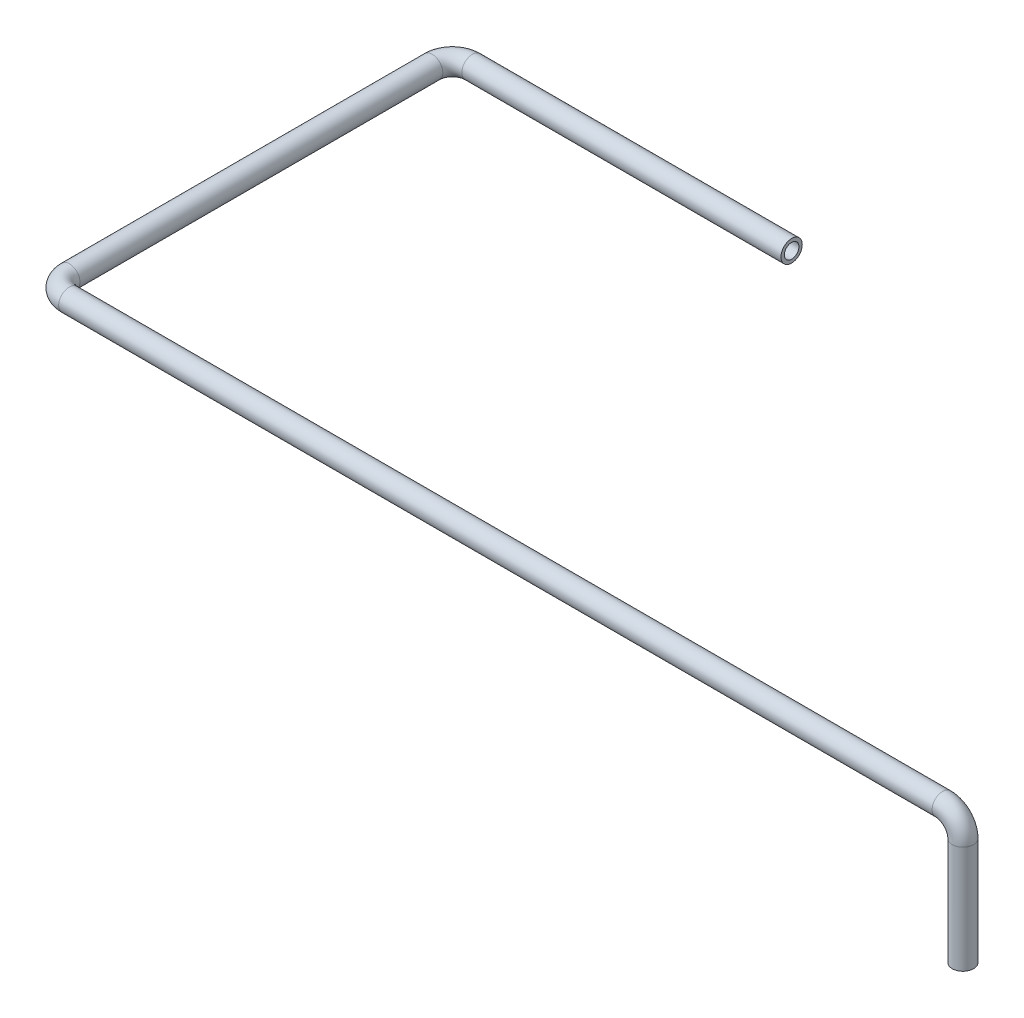
ISO-10303-21;
HEADER;
FILE_DESCRIPTION(('STEP AP214'),'2;1');
FILE_NAME('part.step','',(''),(''),'','','');
FILE_SCHEMA(('AUTOMOTIVE_DESIGN { 1 0 10303 214 1 1 1 1 }'));
ENDSEC;
DATA;
#1=APPLICATION_CONTEXT('core data for automotive mechanical design processes');
#2=APPLICATION_PROTOCOL_DEFINITION('international standard','automotive_design',2000,#1);
#3=PRODUCT_CONTEXT('',#1,'mechanical');
#4=PRODUCT('Part','Part','',(#3));
#5=PRODUCT_RELATED_PRODUCT_CATEGORY('part','',(#4));
#6=PRODUCT_DEFINITION_FORMATION('','',#4);
#7=PRODUCT_DEFINITION_CONTEXT('part definition',#1,'design');
#8=PRODUCT_DEFINITION('design','',#6,#7);
#9=PRODUCT_DEFINITION_SHAPE('','',#8);
#10=(LENGTH_UNIT() NAMED_UNIT(*) SI_UNIT(.MILLI.,.METRE.));
#11=(NAMED_UNIT(*) PLANE_ANGLE_UNIT() SI_UNIT($,.RADIAN.));
#12=(NAMED_UNIT(*) SI_UNIT($,.STERADIAN.) SOLID_ANGLE_UNIT());
#13=UNCERTAINTY_MEASURE_WITH_UNIT(LENGTH_MEASURE(1.E-05),#10,'distance_accuracy_value','');
#14=(GEOMETRIC_REPRESENTATION_CONTEXT(3) GLOBAL_UNCERTAINTY_ASSIGNED_CONTEXT((#13)) GLOBAL_UNIT_ASSIGNED_CONTEXT((#10,
#11,#12)) REPRESENTATION_CONTEXT('',''));
#15=CARTESIAN_POINT('',(0.,0.,0.));
#16=DIRECTION('',(0.,0.,1.));
#17=DIRECTION('',(1.,0.,0.));
#18=AXIS2_PLACEMENT_3D('',#15,#16,#17);
#19=CARTESIAN_POINT('',(11.,381.,67.5));
#20=DIRECTION('',(1.,0.,0.));
#21=DIRECTION('',(0.,0.,-1.));
#22=AXIS2_PLACEMENT_3D('',#19,#20,#21);
#23=PLANE('',#22);
#24=CARTESIAN_POINT('',(11.,381.,67.5));
#25=DIRECTION('',(1.,0.,0.));
#26=DIRECTION('',(0.,0.,-1.));
#27=AXIS2_PLACEMENT_3D('',#24,#25,#26);
#28=CIRCLE('',#27,2.17500000000001);
#29=CARTESIAN_POINT('',(11.,381.,65.325));
#30=VERTEX_POINT('',#29);
#31=EDGE_CURVE('E263',#30,#30,#28,.T.);
#32=ORIENTED_EDGE('',*,*,#31,.F.);
#33=EDGE_LOOP('',(#32));
#34=FACE_BOUND('',#33,.T.);
#35=CARTESIAN_POINT('',(11.,381.,67.5));
#36=DIRECTION('',(1.,0.,0.));
#37=DIRECTION('',(0.,0.,-1.));
#38=AXIS2_PLACEMENT_3D('',#35,#36,#37);
#39=CIRCLE('',#38,3.17500000000001);
#40=CARTESIAN_POINT('',(11.,381.,64.325));
#41=VERTEX_POINT('',#40);
#42=EDGE_CURVE('E75',#41,#41,#39,.T.);
#43=ORIENTED_EDGE('',*,*,#42,.T.);
#44=EDGE_LOOP('',(#43));
#45=FACE_BOUND('',#44,.T.);
#46=ADVANCED_FACE('F52',(#34,#45),#23,.T.);
#47=CARTESIAN_POINT('',(182.,343.,187.5));
#48=DIRECTION('',(0.,1.,0.));
#49=DIRECTION('',(0.,0.,1.));
#50=AXIS2_PLACEMENT_3D('',#47,#48,#49);
#51=PLANE('',#50);
#52=CARTESIAN_POINT('',(182.,343.,187.5));
#53=DIRECTION('',(0.,1.,0.));
#54=DIRECTION('',(0.,0.,1.));
#55=AXIS2_PLACEMENT_3D('',#52,#53,#54);
#56=CIRCLE('',#55,2.17500000000001);
#57=CARTESIAN_POINT('',(182.,343.,189.675));
#58=VERTEX_POINT('',#57);
#59=EDGE_CURVE('E73',#58,#58,#56,.T.);
#60=ORIENTED_EDGE('',*,*,#59,.T.);
#61=EDGE_LOOP('',(#60));
#62=FACE_BOUND('',#61,.T.);
#63=CARTESIAN_POINT('',(182.,343.,187.5));
#64=DIRECTION('',(0.,1.,0.));
#65=DIRECTION('',(0.,0.,1.));
#66=AXIS2_PLACEMENT_3D('',#63,#64,#65);
#67=CIRCLE('',#66,3.17500000000001);
#68=CARTESIAN_POINT('',(182.,343.,190.675));
#69=VERTEX_POINT('',#68);
#70=EDGE_CURVE('E11',#69,#69,#67,.T.);
#71=ORIENTED_EDGE('',*,*,#70,.F.);
#72=EDGE_LOOP('',(#71));
#73=FACE_BOUND('',#72,.T.);
#74=ADVANCED_FACE('F149',(#62,#73),#51,.F.);
#75=CARTESIAN_POINT('',(11.,381.,67.5));
#76=DIRECTION('',(-1.,0.,0.));
#77=DIRECTION('',(0.,0.,1.));
#78=AXIS2_PLACEMENT_3D('',#75,#76,#77);
#79=CYLINDRICAL_SURFACE('',#78,3.17500000000001);
#80=CARTESIAN_POINT('',(-84.,381.,67.5));
#81=DIRECTION('',(-1.,0.,0.));
#82=DIRECTION('',(0.,0.,1.));
#83=AXIS2_PLACEMENT_3D('',#80,#81,#82);
#84=CIRCLE('',#83,3.17500000000001);
#85=CARTESIAN_POINT('',(-83.9999999999999,381.,64.325));
#86=VERTEX_POINT('',#85);
#87=EDGE_CURVE('E74',#86,#86,#84,.F.);
#88=ORIENTED_EDGE('',*,*,#87,.T.);
#89=EDGE_LOOP('',(#88));
#90=FACE_BOUND('',#89,.T.);
#91=ORIENTED_EDGE('',*,*,#42,.F.);
#92=EDGE_LOOP('',(#91));
#93=FACE_BOUND('',#92,.T.);
#94=ADVANCED_FACE('F155',(#90,#93),#79,.T.);
#95=CARTESIAN_POINT('',(-84.,381.,73.5));
#96=DIRECTION('',(0.,1.,0.));
#97=DIRECTION('',(0.,0.,1.));
#98=AXIS2_PLACEMENT_3D('',#95,#96,#97);
#99=TOROIDAL_SURFACE('',#98,6.00000000000001,3.17500000000001);
#100=CARTESIAN_POINT('',(-90.,381.,73.5));
#101=DIRECTION('',(0.,0.,-1.));
#102=DIRECTION('',(-1.,0.,0.));
#103=AXIS2_PLACEMENT_3D('',#100,#101,#102);
#104=CIRCLE('',#103,3.17500000000001);
#105=CARTESIAN_POINT('',(-93.175,381.,73.5));
#106=VERTEX_POINT('',#105);
#107=EDGE_CURVE('E78',#106,#106,#104,.T.);
#108=CARTESIAN_POINT('',(-84.,381.,73.5));
#109=DIRECTION('',(0.,1.,0.));
#110=DIRECTION('',(0.,0.,1.));
#111=AXIS2_PLACEMENT_3D('',#108,#109,#110);
#112=CIRCLE('',#111,9.17500000000002);
#113=EDGE_CURVE('',#86,#106,#112,.T.);
#114=ORIENTED_EDGE('',*,*,#87,.F.);
#115=ORIENTED_EDGE('',*,*,#107,.T.);
#116=ORIENTED_EDGE('',*,*,#113,.T.);
#117=ORIENTED_EDGE('',*,*,#113,.F.);
#118=EDGE_LOOP('',(#114,#116,#115,#117));
#119=FACE_BOUND('',#118,.T.);
#120=ADVANCED_FACE('F158',(#119),#99,.T.);
#121=CARTESIAN_POINT('',(-90.,381.,73.5));
#122=DIRECTION('',(0.,0.,1.));
#123=DIRECTION('',(1.,0.,0.));
#124=AXIS2_PLACEMENT_3D('',#121,#122,#123);
#125=CYLINDRICAL_SURFACE('',#124,3.17500000000001);
#126=CARTESIAN_POINT('',(-90.,381.,181.5));
#127=DIRECTION('',(0.,0.,1.));
#128=DIRECTION('',(1.,0.,0.));
#129=AXIS2_PLACEMENT_3D('',#126,#127,#128);
#130=CIRCLE('',#129,3.17500000000001);
#131=CARTESIAN_POINT('',(-93.175,381.,181.5));
#132=VERTEX_POINT('',#131);
#133=EDGE_CURVE('E91',#132,#132,#130,.F.);
#134=ORIENTED_EDGE('',*,*,#133,.T.);
#135=EDGE_LOOP('',(#134));
#136=FACE_BOUND('',#135,.T.);
#137=ORIENTED_EDGE('',*,*,#107,.F.);
#138=EDGE_LOOP('',(#137));
#139=FACE_BOUND('',#138,.T.);
#140=ADVANCED_FACE('F109',(#136,#139),#125,.T.);
#141=CARTESIAN_POINT('',(-84.,381.,181.5));
#142=DIRECTION('',(0.,1.,0.));
#143=DIRECTION('',(0.,0.,1.));
#144=AXIS2_PLACEMENT_3D('',#141,#142,#143);
#145=TOROIDAL_SURFACE('',#144,6.00000000000001,3.17500000000001);
#146=CARTESIAN_POINT('',(-84.,381.,187.5));
#147=DIRECTION('',(-1.,0.,0.));
#148=DIRECTION('',(0.,0.,1.));
#149=AXIS2_PLACEMENT_3D('',#146,#147,#148);
#150=CIRCLE('',#149,3.17500000000001);
#151=CARTESIAN_POINT('',(-84.0000000000001,381.,190.675));
#152=VERTEX_POINT('',#151);
#153=EDGE_CURVE('E68',#152,#152,#150,.T.);
#154=CARTESIAN_POINT('',(-84.,381.,181.5));
#155=DIRECTION('',(0.,1.,0.));
#156=DIRECTION('',(0.,0.,1.));
#157=AXIS2_PLACEMENT_3D('',#154,#155,#156);
#158=CIRCLE('',#157,9.17500000000002);
#159=EDGE_CURVE('',#132,#152,#158,.T.);
#160=ORIENTED_EDGE('',*,*,#133,.F.);
#161=ORIENTED_EDGE('',*,*,#153,.T.);
#162=ORIENTED_EDGE('',*,*,#159,.T.);
#163=ORIENTED_EDGE('',*,*,#159,.F.);
#164=EDGE_LOOP('',(#160,#162,#161,#163));
#165=FACE_BOUND('',#164,.T.);
#166=ADVANCED_FACE('F98',(#165),#145,.T.);
#167=CARTESIAN_POINT('',(-84.,381.,187.5));
#168=DIRECTION('',(1.,0.,0.));
#169=DIRECTION('',(0.,0.,-1.));
#170=AXIS2_PLACEMENT_3D('',#167,#168,#169);
#171=CYLINDRICAL_SURFACE('',#170,3.17500000000001);
#172=CARTESIAN_POINT('',(176.,381.,187.5));
#173=DIRECTION('',(1.,0.,0.));
#174=DIRECTION('',(0.,0.,-1.));
#175=AXIS2_PLACEMENT_3D('',#172,#173,#174);
#176=CIRCLE('',#175,3.17500000000001);
#177=CARTESIAN_POINT('',(176.,384.175,187.5));
#178=VERTEX_POINT('',#177);
#179=EDGE_CURVE('E63',#178,#178,#176,.F.);
#180=ORIENTED_EDGE('',*,*,#179,.T.);
#181=EDGE_LOOP('',(#180));
#182=FACE_BOUND('',#181,.T.);
#183=ORIENTED_EDGE('',*,*,#153,.F.);
#184=EDGE_LOOP('',(#183));
#185=FACE_BOUND('',#184,.T.);
#186=ADVANCED_FACE('F101',(#182,#185),#171,.T.);
#187=CARTESIAN_POINT('',(176.,375.,187.5));
#188=DIRECTION('',(0.,0.,-1.));
#189=DIRECTION('',(-1.,0.,0.));
#190=AXIS2_PLACEMENT_3D('',#187,#188,#189);
#191=TOROIDAL_SURFACE('',#190,6.00000000000001,3.17500000000001);
#192=CARTESIAN_POINT('',(182.,374.999999999998,187.5));
#193=DIRECTION('',(2.68107418069523E-13,1.,0.));
#194=DIRECTION('',(-1.,2.68107418069523E-13,0.));
#195=AXIS2_PLACEMENT_3D('',#192,#193,#194);
#196=CIRCLE('',#195,3.17500000000001);
#197=CARTESIAN_POINT('',(185.175,374.999999999998,187.5));
#198=VERTEX_POINT('',#197);
#199=EDGE_CURVE('E58',#198,#198,#196,.T.);
#200=CARTESIAN_POINT('',(176.,375.,187.5));
#201=DIRECTION('',(0.,0.,-1.));
#202=DIRECTION('',(-1.,0.,0.));
#203=AXIS2_PLACEMENT_3D('',#200,#201,#202);
#204=CIRCLE('',#203,9.17500000000002);
#205=EDGE_CURVE('',#178,#198,#204,.T.);
#206=ORIENTED_EDGE('',*,*,#179,.F.);
#207=ORIENTED_EDGE('',*,*,#199,.T.);
#208=ORIENTED_EDGE('',*,*,#205,.T.);
#209=ORIENTED_EDGE('',*,*,#205,.F.);
#210=EDGE_LOOP('',(#206,#208,#207,#209));
#211=FACE_BOUND('',#210,.T.);
#212=ADVANCED_FACE('F103',(#211),#191,.T.);
#213=CARTESIAN_POINT('',(182.,375.,187.5));
#214=DIRECTION('',(0.,-1.,0.));
#215=DIRECTION('',(0.,0.,-1.));
#216=AXIS2_PLACEMENT_3D('',#213,#214,#215);
#217=CYLINDRICAL_SURFACE('',#216,3.17500000000001);
#218=ORIENTED_EDGE('',*,*,#70,.T.);
#219=EDGE_LOOP('',(#218));
#220=FACE_BOUND('',#219,.T.);
#221=ORIENTED_EDGE('',*,*,#199,.F.);
#222=EDGE_LOOP('',(#221));
#223=FACE_BOUND('',#222,.T.);
#224=ADVANCED_FACE('F54',(#220,#223),#217,.T.);
#225=CARTESIAN_POINT('',(11.,381.,67.5));
#226=DIRECTION('',(-1.,0.,0.));
#227=DIRECTION('',(0.,0.,1.));
#228=AXIS2_PLACEMENT_3D('',#225,#226,#227);
#229=CYLINDRICAL_SURFACE('',#228,2.17500000000001);
#230=CARTESIAN_POINT('',(-84.,381.,67.5));
#231=DIRECTION('',(1.,0.,0.));
#232=DIRECTION('',(0.,0.,-1.));
#233=AXIS2_PLACEMENT_3D('',#230,#231,#232);
#234=CIRCLE('',#233,2.17500000000001);
#235=CARTESIAN_POINT('',(-83.9999999999999,381.,65.325));
#236=VERTEX_POINT('',#235);
#237=EDGE_CURVE('E262',#236,#236,#234,.T.);
#238=ORIENTED_EDGE('',*,*,#237,.F.);
#239=EDGE_LOOP('',(#238));
#240=FACE_BOUND('',#239,.T.);
#241=ORIENTED_EDGE('',*,*,#31,.T.);
#242=EDGE_LOOP('',(#241));
#243=FACE_BOUND('',#242,.T.);
#244=ADVANCED_FACE('F114',(#240,#243),#229,.F.);
#245=CARTESIAN_POINT('',(-84.,381.,73.5));
#246=DIRECTION('',(0.,1.,0.));
#247=DIRECTION('',(0.,0.,1.));
#248=AXIS2_PLACEMENT_3D('',#245,#246,#247);
#249=TOROIDAL_SURFACE('',#248,6.00000000000001,2.17500000000001);
#250=CARTESIAN_POINT('',(-90.,381.,73.5));
#251=DIRECTION('',(0.,0.,-1.));
#252=DIRECTION('',(-1.,0.,0.));
#253=AXIS2_PLACEMENT_3D('',#250,#251,#252);
#254=CIRCLE('',#253,2.17500000000001);
#255=CARTESIAN_POINT('',(-92.175,381.,73.5));
#256=VERTEX_POINT('',#255);
#257=EDGE_CURVE('E270',#256,#256,#254,.T.);
#258=CARTESIAN_POINT('',(-84.,381.,73.5));
#259=DIRECTION('',(0.,1.,0.));
#260=DIRECTION('',(0.,0.,1.));
#261=AXIS2_PLACEMENT_3D('',#258,#259,#260);
#262=CIRCLE('',#261,8.17500000000001);
#263=EDGE_CURVE('',#236,#256,#262,.T.);
#264=ORIENTED_EDGE('',*,*,#237,.T.);
#265=ORIENTED_EDGE('',*,*,#257,.F.);
#266=ORIENTED_EDGE('',*,*,#263,.T.);
#267=ORIENTED_EDGE('',*,*,#263,.F.);
#268=EDGE_LOOP('',(#264,#266,#265,#267));
#269=FACE_BOUND('',#268,.T.);
#270=ADVANCED_FACE('F116',(#269),#249,.F.);
#271=CARTESIAN_POINT('',(-90.,381.,73.5));
#272=DIRECTION('',(0.,0.,1.));
#273=DIRECTION('',(1.,0.,0.));
#274=AXIS2_PLACEMENT_3D('',#271,#272,#273);
#275=CYLINDRICAL_SURFACE('',#274,2.17500000000001);
#276=CARTESIAN_POINT('',(-90.,381.,181.5));
#277=DIRECTION('',(0.,0.,-1.));
#278=DIRECTION('',(-1.,0.,0.));
#279=AXIS2_PLACEMENT_3D('',#276,#277,#278);
#280=CIRCLE('',#279,2.17500000000001);
#281=CARTESIAN_POINT('',(-92.175,381.,181.5));
#282=VERTEX_POINT('',#281);
#283=EDGE_CURVE('E275',#282,#282,#280,.T.);
#284=ORIENTED_EDGE('',*,*,#283,.F.);
#285=EDGE_LOOP('',(#284));
#286=FACE_BOUND('',#285,.T.);
#287=ORIENTED_EDGE('',*,*,#257,.T.);
#288=EDGE_LOOP('',(#287));
#289=FACE_BOUND('',#288,.T.);
#290=ADVANCED_FACE('F123',(#286,#289),#275,.F.);
#291=CARTESIAN_POINT('',(-84.,381.,181.5));
#292=DIRECTION('',(0.,1.,0.));
#293=DIRECTION('',(0.,0.,1.));
#294=AXIS2_PLACEMENT_3D('',#291,#292,#293);
#295=TOROIDAL_SURFACE('',#294,6.00000000000001,2.17500000000001);
#296=CARTESIAN_POINT('',(-84.,381.,187.5));
#297=DIRECTION('',(-1.,0.,0.));
#298=DIRECTION('',(0.,0.,1.));
#299=AXIS2_PLACEMENT_3D('',#296,#297,#298);
#300=CIRCLE('',#299,2.17500000000001);
#301=CARTESIAN_POINT('',(-84.,381.,189.675));
#302=VERTEX_POINT('',#301);
#303=EDGE_CURVE('E274',#302,#302,#300,.T.);
#304=CARTESIAN_POINT('',(-84.,381.,181.5));
#305=DIRECTION('',(0.,1.,0.));
#306=DIRECTION('',(0.,0.,1.));
#307=AXIS2_PLACEMENT_3D('',#304,#305,#306);
#308=CIRCLE('',#307,8.17500000000001);
#309=EDGE_CURVE('',#282,#302,#308,.T.);
#310=ORIENTED_EDGE('',*,*,#283,.T.);
#311=ORIENTED_EDGE('',*,*,#303,.F.);
#312=ORIENTED_EDGE('',*,*,#309,.T.);
#313=ORIENTED_EDGE('',*,*,#309,.F.);
#314=EDGE_LOOP('',(#310,#312,#311,#313));
#315=FACE_BOUND('',#314,.T.);
#316=ADVANCED_FACE('F131',(#315),#295,.F.);
#317=CARTESIAN_POINT('',(-84.,381.,187.5));
#318=DIRECTION('',(1.,0.,0.));
#319=DIRECTION('',(0.,0.,-1.));
#320=AXIS2_PLACEMENT_3D('',#317,#318,#319);
#321=CYLINDRICAL_SURFACE('',#320,2.17500000000001);
#322=CARTESIAN_POINT('',(176.,381.,187.5));
#323=DIRECTION('',(-1.,0.,0.));
#324=DIRECTION('',(0.,0.,1.));
#325=AXIS2_PLACEMENT_3D('',#322,#323,#324);
#326=CIRCLE('',#325,2.17500000000001);
#327=CARTESIAN_POINT('',(176.,383.175,187.5));
#328=VERTEX_POINT('',#327);
#329=EDGE_CURVE('E87',#328,#328,#326,.T.);
#330=ORIENTED_EDGE('',*,*,#329,.F.);
#331=EDGE_LOOP('',(#330));
#332=FACE_BOUND('',#331,.T.);
#333=ORIENTED_EDGE('',*,*,#303,.T.);
#334=EDGE_LOOP('',(#333));
#335=FACE_BOUND('',#334,.T.);
#336=ADVANCED_FACE('F136',(#332,#335),#321,.F.);
#337=CARTESIAN_POINT('',(176.,375.,187.5));
#338=DIRECTION('',(0.,0.,-1.));
#339=DIRECTION('',(-1.,0.,0.));
#340=AXIS2_PLACEMENT_3D('',#337,#338,#339);
#341=TOROIDAL_SURFACE('',#340,6.00000000000001,2.17500000000001);
#342=CARTESIAN_POINT('',(182.000000000003,374.999999999998,187.5));
#343=DIRECTION('',(0.,1.,0.));
#344=DIRECTION('',(0.,0.,1.));
#345=AXIS2_PLACEMENT_3D('',#342,#343,#344);
#346=CIRCLE('',#345,2.17500000000001);
#347=CARTESIAN_POINT('',(184.175,374.999999999998,187.5));
#348=VERTEX_POINT('',#347);
#349=EDGE_CURVE('E85',#348,#348,#346,.T.);
#350=CARTESIAN_POINT('',(176.,375.,187.5));
#351=DIRECTION('',(0.,0.,-1.));
#352=DIRECTION('',(-1.,0.,0.));
#353=AXIS2_PLACEMENT_3D('',#350,#351,#352);
#354=CIRCLE('',#353,8.17500000000001);
#355=EDGE_CURVE('',#328,#348,#354,.T.);
#356=ORIENTED_EDGE('',*,*,#329,.T.);
#357=ORIENTED_EDGE('',*,*,#349,.F.);
#358=ORIENTED_EDGE('',*,*,#355,.T.);
#359=ORIENTED_EDGE('',*,*,#355,.F.);
#360=EDGE_LOOP('',(#356,#358,#357,#359));
#361=FACE_BOUND('',#360,.T.);
#362=ADVANCED_FACE('F139',(#361),#341,.F.);
#363=CARTESIAN_POINT('',(182.,375.,187.5));
#364=DIRECTION('',(0.,-1.,0.));
#365=DIRECTION('',(0.,0.,-1.));
#366=AXIS2_PLACEMENT_3D('',#363,#364,#365);
#367=CYLINDRICAL_SURFACE('',#366,2.17500000000001);
#368=ORIENTED_EDGE('',*,*,#59,.F.);
#369=EDGE_LOOP('',(#368));
#370=FACE_BOUND('',#369,.T.);
#371=ORIENTED_EDGE('',*,*,#349,.T.);
#372=EDGE_LOOP('',(#371));
#373=FACE_BOUND('',#372,.T.);
#374=ADVANCED_FACE('F145',(#370,#373),#367,.F.);
#375=CLOSED_SHELL('',(#46,#74,#94,#120,#140,#166,#186,#212,#224,#244,#270,#290,#316,#336,#362,#374));
#376=MANIFOLD_SOLID_BREP('B2',#375);
#377=ADVANCED_BREP_SHAPE_REPRESENTATION('',(#18,#376),#14);
#378=SHAPE_DEFINITION_REPRESENTATION(#9,#377);
ENDSEC;
END-ISO-10303-21;
